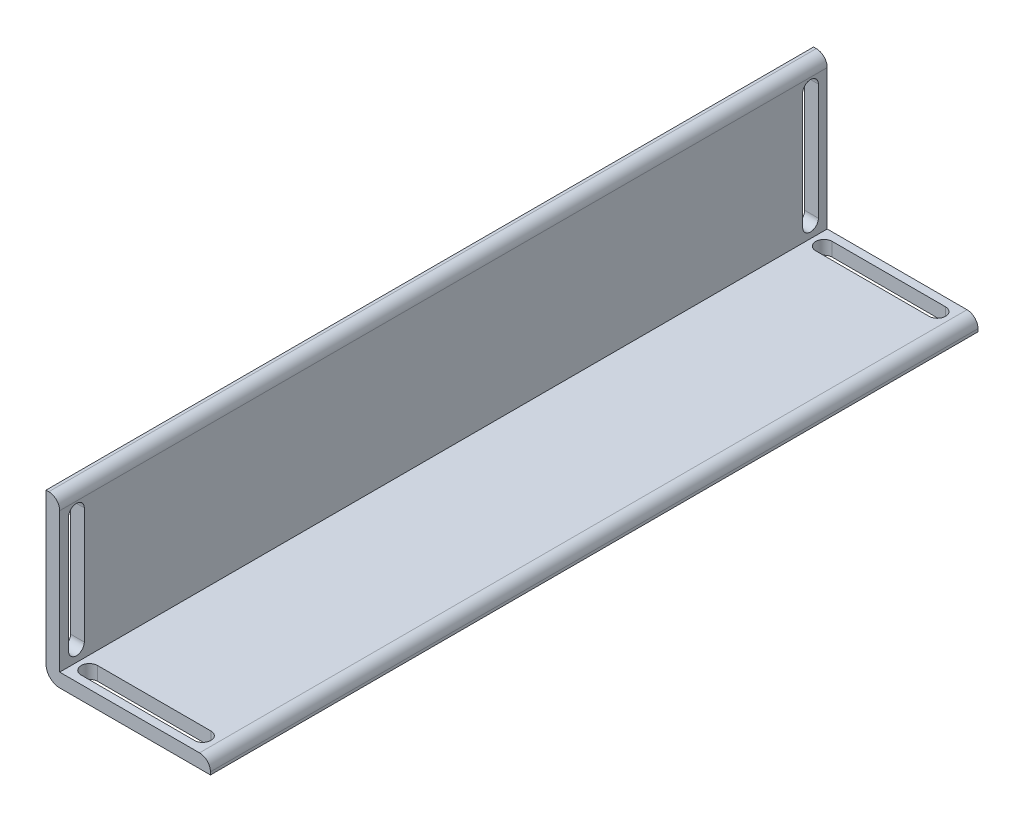
ISO-10303-21;
HEADER;
FILE_DESCRIPTION(('STEP AP214'),'2;1');
FILE_NAME('part.step','',(''),(''),'','','');
FILE_SCHEMA(('AUTOMOTIVE_DESIGN { 1 0 10303 214 1 1 1 1 }'));
ENDSEC;
DATA;
#1=APPLICATION_CONTEXT('core data for automotive mechanical design processes');
#2=APPLICATION_PROTOCOL_DEFINITION('international standard','automotive_design',2000,#1);
#3=PRODUCT_CONTEXT('',#1,'mechanical');
#4=PRODUCT('Part','Part','',(#3));
#5=PRODUCT_RELATED_PRODUCT_CATEGORY('part','',(#4));
#6=PRODUCT_DEFINITION_FORMATION('','',#4);
#7=PRODUCT_DEFINITION_CONTEXT('part definition',#1,'design');
#8=PRODUCT_DEFINITION('design','',#6,#7);
#9=PRODUCT_DEFINITION_SHAPE('','',#8);
#10=(LENGTH_UNIT() NAMED_UNIT(*) SI_UNIT(.MILLI.,.METRE.));
#11=(NAMED_UNIT(*) PLANE_ANGLE_UNIT() SI_UNIT($,.RADIAN.));
#12=(NAMED_UNIT(*) SI_UNIT($,.STERADIAN.) SOLID_ANGLE_UNIT());
#13=UNCERTAINTY_MEASURE_WITH_UNIT(LENGTH_MEASURE(1.E-05),#10,'distance_accuracy_value','');
#14=(GEOMETRIC_REPRESENTATION_CONTEXT(3) GLOBAL_UNCERTAINTY_ASSIGNED_CONTEXT((#13)) GLOBAL_UNIT_ASSIGNED_CONTEXT((#10,
#11,#12)) REPRESENTATION_CONTEXT('',''));
#15=CARTESIAN_POINT('',(0.,0.,0.));
#16=DIRECTION('',(0.,0.,1.));
#17=DIRECTION('',(1.,0.,0.));
#18=AXIS2_PLACEMENT_3D('',#15,#16,#17);
#19=CARTESIAN_POINT('',(38.1,0.,177.8));
#20=DIRECTION('',(0.,1.,0.));
#21=DIRECTION('',(-1.,0.,0.));
#22=AXIS2_PLACEMENT_3D('',#19,#20,#21);
#23=PLANE('',#22);
#24=CARTESIAN_POINT('',(6.23203601937777,0.,173.99));
#25=DIRECTION('',(0.,-1.,0.));
#26=DIRECTION('',(1.,0.,0.));
#27=AXIS2_PLACEMENT_3D('',#24,#25,#26);
#28=CIRCLE('',#27,1.90500000000002);
#29=CARTESIAN_POINT('',(6.23203601937777,0.,175.895));
#30=VERTEX_POINT('',#29);
#31=CARTESIAN_POINT('',(6.23203601937777,0.,172.085));
#32=VERTEX_POINT('',#31);
#33=EDGE_CURVE('E225',#30,#32,#28,.T.);
#34=ORIENTED_EDGE('',*,*,#33,.F.);
#35=DIRECTION('',(-1.,0.,0.));
#36=VECTOR('',#35,1.);
#37=CARTESIAN_POINT('',(1.85924714280096E-13,0.,175.895));
#38=LINE('',#37,#36);
#39=CARTESIAN_POINT('',(32.4903362771703,0.,175.895));
#40=VERTEX_POINT('',#39);
#41=EDGE_CURVE('E55',#40,#30,#38,.T.);
#42=ORIENTED_EDGE('',*,*,#41,.F.);
#43=CARTESIAN_POINT('',(32.4903362771703,0.,173.99));
#44=DIRECTION('',(0.,-1.,0.));
#45=DIRECTION('',(1.,0.,0.));
#46=AXIS2_PLACEMENT_3D('',#43,#44,#45);
#47=CIRCLE('',#46,1.90499999999999);
#48=CARTESIAN_POINT('',(32.4903362771703,0.,172.085));
#49=VERTEX_POINT('',#48);
#50=EDGE_CURVE('E232',#49,#40,#47,.T.);
#51=ORIENTED_EDGE('',*,*,#50,.F.);
#52=DIRECTION('',(-1.,0.,0.));
#53=VECTOR('',#52,1.);
#54=CARTESIAN_POINT('',(-1.81897464151285E-13,0.,172.085));
#55=LINE('',#54,#53);
#56=EDGE_CURVE('E214',#49,#32,#55,.T.);
#57=ORIENTED_EDGE('',*,*,#56,.T.);
#58=EDGE_LOOP('',(#34,#42,#51,#57));
#59=FACE_BOUND('',#58,.T.);
#60=DIRECTION('',(1.,0.,0.));
#61=VECTOR('',#60,1.);
#62=CARTESIAN_POINT('',(38.1,0.,177.8));
#63=LINE('',#62,#61);
#64=CARTESIAN_POINT('',(3.17500000000001,0.,177.8));
#65=VERTEX_POINT('',#64);
#66=CARTESIAN_POINT('',(38.1,0.,177.8));
#67=VERTEX_POINT('',#66);
#68=EDGE_CURVE('E330',#65,#67,#63,.T.);
#69=ORIENTED_EDGE('',*,*,#68,.F.);
#70=DIRECTION('',(0.,0.,-1.));
#71=VECTOR('',#70,1.);
#72=CARTESIAN_POINT('',(3.175,0.,177.8));
#73=LINE('',#72,#71);
#74=CARTESIAN_POINT('',(3.17500000000001,0.,0.));
#75=VERTEX_POINT('',#74);
#76=EDGE_CURVE('E407',#65,#75,#73,.T.);
#77=ORIENTED_EDGE('',*,*,#76,.T.);
#78=DIRECTION('',(1.,0.,0.));
#79=VECTOR('',#78,1.);
#80=CARTESIAN_POINT('',(38.1,0.,0.));
#81=LINE('',#80,#79);
#82=CARTESIAN_POINT('',(38.1,0.,0.));
#83=VERTEX_POINT('',#82);
#84=EDGE_CURVE('E293',#75,#83,#81,.T.);
#85=ORIENTED_EDGE('',*,*,#84,.T.);
#86=DIRECTION('',(0.,0.,-1.));
#87=VECTOR('',#86,1.);
#88=CARTESIAN_POINT('',(38.1,0.,177.8));
#89=LINE('',#88,#87);
#90=EDGE_CURVE('E403',#67,#83,#89,.T.);
#91=ORIENTED_EDGE('',*,*,#90,.F.);
#92=EDGE_LOOP('',(#69,#77,#85,#91));
#93=FACE_BOUND('',#92,.T.);
#94=CARTESIAN_POINT('',(6.23203601937779,0.,3.81000000000001));
#95=DIRECTION('',(0.,-1.,0.));
#96=DIRECTION('',(1.,0.,0.));
#97=AXIS2_PLACEMENT_3D('',#94,#95,#96);
#98=CIRCLE('',#97,1.90500000000002);
#99=CARTESIAN_POINT('',(6.23203601937778,0.,1.90499999999998));
#100=VERTEX_POINT('',#99);
#101=CARTESIAN_POINT('',(6.23203601937779,0.,5.71500000000003));
#102=VERTEX_POINT('',#101);
#103=EDGE_CURVE('E63',#100,#102,#98,.F.);
#104=ORIENTED_EDGE('',*,*,#103,.T.);
#105=DIRECTION('',(-1.,0.,0.));
#106=VECTOR('',#105,1.);
#107=CARTESIAN_POINT('',(0.,0.,5.71500000000003));
#108=LINE('',#107,#106);
#109=CARTESIAN_POINT('',(32.4903362771703,0.,5.715));
#110=VERTEX_POINT('',#109);
#111=EDGE_CURVE('E257',#110,#102,#108,.T.);
#112=ORIENTED_EDGE('',*,*,#111,.F.);
#113=CARTESIAN_POINT('',(32.4903362771703,0.,3.81000000000001));
#114=DIRECTION('',(0.,-1.,0.));
#115=DIRECTION('',(1.,0.,0.));
#116=AXIS2_PLACEMENT_3D('',#113,#114,#115);
#117=CIRCLE('',#116,1.90499999999999);
#118=CARTESIAN_POINT('',(32.4903362771703,0.,1.90500000000002));
#119=VERTEX_POINT('',#118);
#120=EDGE_CURVE('E253',#110,#119,#117,.F.);
#121=ORIENTED_EDGE('',*,*,#120,.T.);
#122=DIRECTION('',(-1.,0.,0.));
#123=VECTOR('',#122,1.);
#124=CARTESIAN_POINT('',(0.,0.,1.90499999999998));
#125=LINE('',#124,#123);
#126=EDGE_CURVE('E249',#119,#100,#125,.T.);
#127=ORIENTED_EDGE('',*,*,#126,.T.);
#128=EDGE_LOOP('',(#104,#112,#121,#127));
#129=FACE_BOUND('',#128,.T.);
#130=ADVANCED_FACE('F39',(#59,#93,#129),#23,.F.);
#131=CARTESIAN_POINT('',(3.175,3.175,177.8));
#132=DIRECTION('',(0.,-1.,0.));
#133=DIRECTION('',(0.,0.,-1.));
#134=AXIS2_PLACEMENT_3D('',#131,#132,#133);
#135=PLANE('',#134);
#136=CARTESIAN_POINT('',(32.4903362771703,3.17500000000001,173.99));
#137=DIRECTION('',(0.,-1.,0.));
#138=DIRECTION('',(0.,0.,-1.));
#139=AXIS2_PLACEMENT_3D('',#136,#137,#138);
#140=CIRCLE('',#139,1.90499999999999);
#141=CARTESIAN_POINT('',(32.4903362771703,3.17500000000001,172.085));
#142=VERTEX_POINT('',#141);
#143=CARTESIAN_POINT('',(32.4903362771703,3.17500000000001,175.895));
#144=VERTEX_POINT('',#143);
#145=EDGE_CURVE('E48',#142,#144,#140,.T.);
#146=ORIENTED_EDGE('',*,*,#145,.T.);
#147=DIRECTION('',(-1.,0.,0.));
#148=VECTOR('',#147,1.);
#149=CARTESIAN_POINT('',(3.175,3.175,175.895));
#150=LINE('',#149,#148);
#151=CARTESIAN_POINT('',(6.23203601937777,3.17500000000001,175.895));
#152=VERTEX_POINT('',#151);
#153=EDGE_CURVE('E11',#144,#152,#150,.T.);
#154=ORIENTED_EDGE('',*,*,#153,.T.);
#155=CARTESIAN_POINT('',(6.23203601937777,3.17500000000001,173.99));
#156=DIRECTION('',(0.,-1.,0.));
#157=DIRECTION('',(0.,0.,-1.));
#158=AXIS2_PLACEMENT_3D('',#155,#156,#157);
#159=CIRCLE('',#158,1.90500000000002);
#160=CARTESIAN_POINT('',(6.23203601937777,3.17500000000001,172.085));
#161=VERTEX_POINT('',#160);
#162=EDGE_CURVE('E463',#152,#161,#159,.T.);
#163=ORIENTED_EDGE('',*,*,#162,.T.);
#164=DIRECTION('',(-1.,0.,0.));
#165=VECTOR('',#164,1.);
#166=CARTESIAN_POINT('',(3.17500000000001,3.175,172.085));
#167=LINE('',#166,#165);
#168=EDGE_CURVE('E217',#142,#161,#167,.T.);
#169=ORIENTED_EDGE('',*,*,#168,.F.);
#170=EDGE_LOOP('',(#146,#154,#163,#169));
#171=FACE_BOUND('',#170,.T.);
#172=DIRECTION('',(-1.,0.,0.));
#173=VECTOR('',#172,1.);
#174=CARTESIAN_POINT('',(3.175,3.175,0.));
#175=LINE('',#174,#173);
#176=CARTESIAN_POINT('',(35.56,3.175,0.));
#177=VERTEX_POINT('',#176);
#178=CARTESIAN_POINT('',(3.175,3.175,0.));
#179=VERTEX_POINT('',#178);
#180=EDGE_CURVE('E365',#177,#179,#175,.T.);
#181=ORIENTED_EDGE('',*,*,#180,.T.);
#182=DIRECTION('',(0.,0.,-1.));
#183=VECTOR('',#182,1.);
#184=CARTESIAN_POINT('',(3.175,3.175,177.8));
#185=LINE('',#184,#183);
#186=CARTESIAN_POINT('',(3.175,3.175,177.8));
#187=VERTEX_POINT('',#186);
#188=EDGE_CURVE('E391',#187,#179,#185,.T.);
#189=ORIENTED_EDGE('',*,*,#188,.F.);
#190=DIRECTION('',(-1.,0.,0.));
#191=VECTOR('',#190,1.);
#192=CARTESIAN_POINT('',(3.175,3.175,177.8));
#193=LINE('',#192,#191);
#194=CARTESIAN_POINT('',(35.56,3.175,177.8));
#195=VERTEX_POINT('',#194);
#196=EDGE_CURVE('E340',#195,#187,#193,.T.);
#197=ORIENTED_EDGE('',*,*,#196,.F.);
#198=DIRECTION('',(0.,0.,-1.));
#199=VECTOR('',#198,1.);
#200=CARTESIAN_POINT('',(35.56,3.175,177.8));
#201=LINE('',#200,#199);
#202=EDGE_CURVE('E395',#195,#177,#201,.T.);
#203=ORIENTED_EDGE('',*,*,#202,.T.);
#204=EDGE_LOOP('',(#181,#189,#197,#203));
#205=FACE_BOUND('',#204,.T.);
#206=CARTESIAN_POINT('',(6.23203601937779,3.17500000000001,3.81000000000001));
#207=DIRECTION('',(0.,-1.,0.));
#208=DIRECTION('',(0.,0.,-1.));
#209=AXIS2_PLACEMENT_3D('',#206,#207,#208);
#210=CIRCLE('',#209,1.90500000000002);
#211=CARTESIAN_POINT('',(6.23203601937779,3.17500000000001,1.90499999999999));
#212=VERTEX_POINT('',#211);
#213=CARTESIAN_POINT('',(6.23203601937779,3.17500000000001,5.71500000000003));
#214=VERTEX_POINT('',#213);
#215=EDGE_CURVE('E460',#212,#214,#210,.F.);
#216=ORIENTED_EDGE('',*,*,#215,.F.);
#217=DIRECTION('',(-1.,0.,0.));
#218=VECTOR('',#217,1.);
#219=CARTESIAN_POINT('',(3.17500000000019,3.175,1.90499999999999));
#220=LINE('',#219,#218);
#221=CARTESIAN_POINT('',(32.4903362771703,3.175,1.90500000000002));
#222=VERTEX_POINT('',#221);
#223=EDGE_CURVE('E449',#222,#212,#220,.T.);
#224=ORIENTED_EDGE('',*,*,#223,.F.);
#225=CARTESIAN_POINT('',(32.4903362771703,3.17500000000001,3.81000000000001));
#226=DIRECTION('',(0.,-1.,0.));
#227=DIRECTION('',(0.,0.,-1.));
#228=AXIS2_PLACEMENT_3D('',#225,#226,#227);
#229=CIRCLE('',#228,1.90499999999999);
#230=CARTESIAN_POINT('',(32.4903362771703,3.17500000000001,5.715));
#231=VERTEX_POINT('',#230);
#232=EDGE_CURVE('E452',#231,#222,#229,.F.);
#233=ORIENTED_EDGE('',*,*,#232,.F.);
#234=DIRECTION('',(-1.,0.,0.));
#235=VECTOR('',#234,1.);
#236=CARTESIAN_POINT('',(3.17499999999982,3.175,5.71500000000003));
#237=LINE('',#236,#235);
#238=EDGE_CURVE('E456',#231,#214,#237,.T.);
#239=ORIENTED_EDGE('',*,*,#238,.T.);
#240=EDGE_LOOP('',(#216,#224,#233,#239));
#241=FACE_BOUND('',#240,.T.);
#242=ADVANCED_FACE('F470',(#171,#205,#241),#135,.F.);
#243=CARTESIAN_POINT('',(3.175,35.56,177.8));
#244=DIRECTION('',(-1.,0.,0.));
#245=DIRECTION('',(0.,-1.,0.));
#246=AXIS2_PLACEMENT_3D('',#243,#244,#245);
#247=PLANE('',#246);
#248=DIRECTION('',(0.,-1.,0.));
#249=VECTOR('',#248,1.);
#250=CARTESIAN_POINT('',(3.175,33.2660008316405,175.757561706071));
#251=LINE('',#250,#249);
#252=CARTESIAN_POINT('',(3.175,33.2660008316405,175.757561706071));
#253=VERTEX_POINT('',#252);
#254=CARTESIAN_POINT('',(3.175,6.35722326987794,175.757561706071));
#255=VERTEX_POINT('',#254);
#256=EDGE_CURVE('E276',#253,#255,#251,.T.);
#257=ORIENTED_EDGE('',*,*,#256,.F.);
#258=CARTESIAN_POINT('',(3.175,33.2660008316405,173.929295250492));
#259=DIRECTION('',(1.,0.,0.));
#260=DIRECTION('',(0.,1.,0.));
#261=AXIS2_PLACEMENT_3D('',#258,#259,#260);
#262=CIRCLE('',#261,1.8282664555785);
#263=CARTESIAN_POINT('',(3.175,33.2660008316405,172.101028794914));
#264=VERTEX_POINT('',#263);
#265=EDGE_CURVE('E273',#264,#253,#262,.T.);
#266=ORIENTED_EDGE('',*,*,#265,.F.);
#267=DIRECTION('',(0.,-1.,0.));
#268=VECTOR('',#267,1.);
#269=CARTESIAN_POINT('',(3.175,33.2660008316405,172.101028794914));
#270=LINE('',#269,#268);
#271=CARTESIAN_POINT('',(3.175,6.35722326987794,172.101028794914));
#272=VERTEX_POINT('',#271);
#273=EDGE_CURVE('E285',#264,#272,#270,.T.);
#274=ORIENTED_EDGE('',*,*,#273,.T.);
#275=CARTESIAN_POINT('',(3.175,6.35722326987794,173.929295250492));
#276=DIRECTION('',(1.,0.,0.));
#277=DIRECTION('',(0.,1.,0.));
#278=AXIS2_PLACEMENT_3D('',#275,#276,#277);
#279=CIRCLE('',#278,1.82826645557849);
#280=EDGE_CURVE('E281',#255,#272,#279,.T.);
#281=ORIENTED_EDGE('',*,*,#280,.F.);
#282=EDGE_LOOP('',(#257,#266,#274,#281));
#283=FACE_BOUND('',#282,.T.);
#284=DIRECTION('',(0.,1.,0.));
#285=VECTOR('',#284,1.);
#286=CARTESIAN_POINT('',(3.175,35.56,0.));
#287=LINE('',#286,#285);
#288=CARTESIAN_POINT('',(3.175,35.56,0.));
#289=VERTEX_POINT('',#288);
#290=EDGE_CURVE('E368',#179,#289,#287,.T.);
#291=ORIENTED_EDGE('',*,*,#290,.T.);
#292=DIRECTION('',(0.,0.,-1.));
#293=VECTOR('',#292,1.);
#294=CARTESIAN_POINT('',(3.175,35.56,177.8));
#295=LINE('',#294,#293);
#296=CARTESIAN_POINT('',(3.175,35.56,177.8));
#297=VERTEX_POINT('',#296);
#298=EDGE_CURVE('E387',#297,#289,#295,.T.);
#299=ORIENTED_EDGE('',*,*,#298,.F.);
#300=DIRECTION('',(0.,1.,0.));
#301=VECTOR('',#300,1.);
#302=CARTESIAN_POINT('',(3.175,35.56,177.8));
#303=LINE('',#302,#301);
#304=EDGE_CURVE('E343',#187,#297,#303,.T.);
#305=ORIENTED_EDGE('',*,*,#304,.F.);
#306=ORIENTED_EDGE('',*,*,#188,.T.);
#307=EDGE_LOOP('',(#291,#299,#305,#306));
#308=FACE_BOUND('',#307,.T.);
#309=CARTESIAN_POINT('',(3.175,33.2660008316405,3.87070474950793));
#310=DIRECTION('',(-1.,0.,0.));
#311=DIRECTION('',(0.,-1.,0.));
#312=AXIS2_PLACEMENT_3D('',#309,#310,#311);
#313=CIRCLE('',#312,1.82826645557849);
#314=CARTESIAN_POINT('',(3.175,33.2660008316405,5.69897120508642));
#315=VERTEX_POINT('',#314);
#316=CARTESIAN_POINT('',(3.175,33.2660008316405,2.04243829392943));
#317=VERTEX_POINT('',#316);
#318=EDGE_CURVE('E277',#315,#317,#313,.T.);
#319=ORIENTED_EDGE('',*,*,#318,.T.);
#320=DIRECTION('',(0.,-1.,0.));
#321=VECTOR('',#320,1.);
#322=CARTESIAN_POINT('',(3.175,33.2660008316405,2.04243829392943));
#323=LINE('',#322,#321);
#324=CARTESIAN_POINT('',(3.175,6.35722326987794,2.04243829392943));
#325=VERTEX_POINT('',#324);
#326=EDGE_CURVE('E323',#317,#325,#323,.T.);
#327=ORIENTED_EDGE('',*,*,#326,.T.);
#328=CARTESIAN_POINT('',(3.175,6.35722326987794,3.87070474950793));
#329=DIRECTION('',(-1.,0.,0.));
#330=DIRECTION('',(0.,-1.,0.));
#331=AXIS2_PLACEMENT_3D('',#328,#329,#330);
#332=CIRCLE('',#331,1.82826645557849);
#333=CARTESIAN_POINT('',(3.175,6.35722326987794,5.69897120508643));
#334=VERTEX_POINT('',#333);
#335=EDGE_CURVE('E319',#325,#334,#332,.T.);
#336=ORIENTED_EDGE('',*,*,#335,.T.);
#337=DIRECTION('',(0.,-1.,0.));
#338=VECTOR('',#337,1.);
#339=CARTESIAN_POINT('',(3.175,33.2660008316405,5.69897120508642));
#340=LINE('',#339,#338);
#341=EDGE_CURVE('E315',#315,#334,#340,.T.);
#342=ORIENTED_EDGE('',*,*,#341,.F.);
#343=EDGE_LOOP('',(#319,#327,#336,#342));
#344=FACE_BOUND('',#343,.T.);
#345=ADVANCED_FACE('F493',(#283,#308,#344),#247,.F.);
#346=CARTESIAN_POINT('',(0.,0.,177.8));
#347=DIRECTION('',(1.,0.,0.));
#348=DIRECTION('',(0.,0.,-1.));
#349=AXIS2_PLACEMENT_3D('',#346,#347,#348);
#350=PLANE('',#349);
#351=DIRECTION('',(0.,-1.,0.));
#352=VECTOR('',#351,1.);
#353=CARTESIAN_POINT('',(0.,0.,172.101028794914));
#354=LINE('',#353,#352);
#355=CARTESIAN_POINT('',(0.,33.2660008316405,172.101028794914));
#356=VERTEX_POINT('',#355);
#357=CARTESIAN_POINT('',(0.,6.35722326987794,172.101028794914));
#358=VERTEX_POINT('',#357);
#359=EDGE_CURVE('E442',#356,#358,#354,.T.);
#360=ORIENTED_EDGE('',*,*,#359,.F.);
#361=CARTESIAN_POINT('',(0.,33.2660008316405,173.929295250492));
#362=DIRECTION('',(1.,0.,0.));
#363=DIRECTION('',(0.,0.,-1.));
#364=AXIS2_PLACEMENT_3D('',#361,#362,#363);
#365=CIRCLE('',#364,1.8282664555785);
#366=CARTESIAN_POINT('',(0.,33.2660008316405,175.757561706071));
#367=VERTEX_POINT('',#366);
#368=EDGE_CURVE('E445',#356,#367,#365,.T.);
#369=ORIENTED_EDGE('',*,*,#368,.T.);
#370=DIRECTION('',(0.,-1.,0.));
#371=VECTOR('',#370,1.);
#372=CARTESIAN_POINT('',(0.,0.,175.757561706071));
#373=LINE('',#372,#371);
#374=CARTESIAN_POINT('',(0.,6.35722326987792,175.757561706071));
#375=VERTEX_POINT('',#374);
#376=EDGE_CURVE('E434',#367,#375,#373,.T.);
#377=ORIENTED_EDGE('',*,*,#376,.T.);
#378=CARTESIAN_POINT('',(0.,6.35722326987794,173.929295250492));
#379=DIRECTION('',(1.,0.,0.));
#380=DIRECTION('',(0.,0.,-1.));
#381=AXIS2_PLACEMENT_3D('',#378,#379,#380);
#382=CIRCLE('',#381,1.82826645557849);
#383=EDGE_CURVE('E438',#375,#358,#382,.T.);
#384=ORIENTED_EDGE('',*,*,#383,.T.);
#385=EDGE_LOOP('',(#360,#369,#377,#384));
#386=FACE_BOUND('',#385,.T.);
#387=DIRECTION('',(0.,-1.,0.));
#388=VECTOR('',#387,1.);
#389=CARTESIAN_POINT('',(0.,0.,0.));
#390=LINE('',#389,#388);
#391=CARTESIAN_POINT('',(0.,38.1,0.));
#392=VERTEX_POINT('',#391);
#393=CARTESIAN_POINT('',(0.,3.175,0.));
#394=VERTEX_POINT('',#393);
#395=EDGE_CURVE('E334',#392,#394,#390,.T.);
#396=ORIENTED_EDGE('',*,*,#395,.T.);
#397=DIRECTION('',(0.,0.,-1.));
#398=VECTOR('',#397,1.);
#399=CARTESIAN_POINT('',(0.,3.175,177.8));
#400=LINE('',#399,#398);
#401=CARTESIAN_POINT('',(0.,3.175,177.8));
#402=VERTEX_POINT('',#401);
#403=EDGE_CURVE('E414',#394,#402,#400,.F.);
#404=ORIENTED_EDGE('',*,*,#403,.T.);
#405=DIRECTION('',(0.,-1.,0.));
#406=VECTOR('',#405,1.);
#407=CARTESIAN_POINT('',(0.,0.,177.8));
#408=LINE('',#407,#406);
#409=CARTESIAN_POINT('',(0.,38.1,177.8));
#410=VERTEX_POINT('',#409);
#411=EDGE_CURVE('E352',#410,#402,#408,.T.);
#412=ORIENTED_EDGE('',*,*,#411,.F.);
#413=DIRECTION('',(0.,0.,-1.));
#414=VECTOR('',#413,1.);
#415=CARTESIAN_POINT('',(0.,38.1,177.8));
#416=LINE('',#415,#414);
#417=EDGE_CURVE('E356',#410,#392,#416,.T.);
#418=ORIENTED_EDGE('',*,*,#417,.T.);
#419=EDGE_LOOP('',(#396,#404,#412,#418));
#420=FACE_BOUND('',#419,.T.);
#421=CARTESIAN_POINT('',(0.,33.2660008316405,3.87070474950793));
#422=DIRECTION('',(1.,0.,0.));
#423=DIRECTION('',(0.,0.,-1.));
#424=AXIS2_PLACEMENT_3D('',#421,#422,#423);
#425=CIRCLE('',#424,1.82826645557849);
#426=CARTESIAN_POINT('',(0.,33.2660008316405,5.69897120508642));
#427=VERTEX_POINT('',#426);
#428=CARTESIAN_POINT('',(0.,33.2660008316405,2.04243829392943));
#429=VERTEX_POINT('',#428);
#430=EDGE_CURVE('E431',#427,#429,#425,.F.);
#431=ORIENTED_EDGE('',*,*,#430,.F.);
#432=DIRECTION('',(0.,-1.,0.));
#433=VECTOR('',#432,1.);
#434=CARTESIAN_POINT('',(0.,0.,5.69897120508642));
#435=LINE('',#434,#433);
#436=CARTESIAN_POINT('',(0.,6.35722326987792,5.69897120508642));
#437=VERTEX_POINT('',#436);
#438=EDGE_CURVE('E420',#427,#437,#435,.T.);
#439=ORIENTED_EDGE('',*,*,#438,.T.);
#440=CARTESIAN_POINT('',(0.,6.35722326987794,3.87070474950793));
#441=DIRECTION('',(1.,0.,0.));
#442=DIRECTION('',(0.,0.,-1.));
#443=AXIS2_PLACEMENT_3D('',#440,#441,#442);
#444=CIRCLE('',#443,1.82826645557849);
#445=CARTESIAN_POINT('',(0.,6.35722326987794,2.04243829392943));
#446=VERTEX_POINT('',#445);
#447=EDGE_CURVE('E424',#446,#437,#444,.F.);
#448=ORIENTED_EDGE('',*,*,#447,.F.);
#449=DIRECTION('',(0.,-1.,0.));
#450=VECTOR('',#449,1.);
#451=CARTESIAN_POINT('',(0.,0.,2.04243829392944));
#452=LINE('',#451,#450);
#453=EDGE_CURVE('E428',#429,#446,#452,.T.);
#454=ORIENTED_EDGE('',*,*,#453,.F.);
#455=EDGE_LOOP('',(#431,#439,#448,#454));
#456=FACE_BOUND('',#455,.T.);
#457=ADVANCED_FACE('F500',(#386,#420,#456),#350,.F.);
#458=CARTESIAN_POINT('',(38.1,0.634999999999997,177.8));
#459=DIRECTION('',(-1.,0.,0.));
#460=DIRECTION('',(0.,0.,1.));
#461=AXIS2_PLACEMENT_3D('',#458,#459,#460);
#462=PLANE('',#461);
#463=DIRECTION('',(0.,1.,0.));
#464=VECTOR('',#463,1.);
#465=CARTESIAN_POINT('',(38.1,0.634999999999997,0.));
#466=LINE('',#465,#464);
#467=CARTESIAN_POINT('',(38.1,0.634999999999997,0.));
#468=VERTEX_POINT('',#467);
#469=EDGE_CURVE('E359',#83,#468,#466,.T.);
#470=ORIENTED_EDGE('',*,*,#469,.T.);
#471=DIRECTION('',(0.,0.,-1.));
#472=VECTOR('',#471,1.);
#473=CARTESIAN_POINT('',(38.1,0.634999999999997,177.8));
#474=LINE('',#473,#472);
#475=CARTESIAN_POINT('',(38.1,0.634999999999997,177.8));
#476=VERTEX_POINT('',#475);
#477=EDGE_CURVE('E399',#476,#468,#474,.T.);
#478=ORIENTED_EDGE('',*,*,#477,.F.);
#479=DIRECTION('',(0.,1.,0.));
#480=VECTOR('',#479,1.);
#481=CARTESIAN_POINT('',(38.1,0.634999999999997,177.8));
#482=LINE('',#481,#480);
#483=EDGE_CURVE('E333',#67,#476,#482,.T.);
#484=ORIENTED_EDGE('',*,*,#483,.F.);
#485=ORIENTED_EDGE('',*,*,#90,.T.);
#486=EDGE_LOOP('',(#470,#478,#484,#485));
#487=FACE_BOUND('',#486,.T.);
#488=ADVANCED_FACE('F496',(#487),#462,.F.);
#489=CARTESIAN_POINT('',(35.56,0.634999999999997,177.8));
#490=DIRECTION('',(0.,0.,-1.));
#491=DIRECTION('',(-1.,0.,0.));
#492=AXIS2_PLACEMENT_3D('',#489,#490,#491);
#493=CYLINDRICAL_SURFACE('',#492,2.54);
#494=CARTESIAN_POINT('',(35.56,0.634999999999997,0.));
#495=DIRECTION('',(0.,0.,1.));
#496=DIRECTION('',(1.,0.,0.));
#497=AXIS2_PLACEMENT_3D('',#494,#495,#496);
#498=CIRCLE('',#497,2.54);
#499=EDGE_CURVE('E362',#468,#177,#498,.T.);
#500=ORIENTED_EDGE('',*,*,#499,.T.);
#501=ORIENTED_EDGE('',*,*,#202,.F.);
#502=CARTESIAN_POINT('',(35.56,0.634999999999997,177.8));
#503=DIRECTION('',(0.,0.,1.));
#504=DIRECTION('',(1.,0.,0.));
#505=AXIS2_PLACEMENT_3D('',#502,#503,#504);
#506=CIRCLE('',#505,2.54);
#507=EDGE_CURVE('E337',#476,#195,#506,.T.);
#508=ORIENTED_EDGE('',*,*,#507,.F.);
#509=ORIENTED_EDGE('',*,*,#477,.T.);
#510=EDGE_LOOP('',(#500,#501,#508,#509));
#511=FACE_BOUND('',#510,.T.);
#512=ADVANCED_FACE('F499',(#511),#493,.T.);
#513=CARTESIAN_POINT('',(0.634999999999998,35.56,177.8));
#514=DIRECTION('',(0.,0.,-1.));
#515=DIRECTION('',(-1.,0.,0.));
#516=AXIS2_PLACEMENT_3D('',#513,#514,#515);
#517=CYLINDRICAL_SURFACE('',#516,2.54);
#518=CARTESIAN_POINT('',(0.634999999999998,35.56,0.));
#519=DIRECTION('',(0.,0.,1.));
#520=DIRECTION('',(1.,0.,0.));
#521=AXIS2_PLACEMENT_3D('',#518,#519,#520);
#522=CIRCLE('',#521,2.54);
#523=CARTESIAN_POINT('',(0.634999999999998,38.1,0.));
#524=VERTEX_POINT('',#523);
#525=EDGE_CURVE('E371',#289,#524,#522,.T.);
#526=ORIENTED_EDGE('',*,*,#525,.T.);
#527=DIRECTION('',(0.,0.,-1.));
#528=VECTOR('',#527,1.);
#529=CARTESIAN_POINT('',(0.634999999999998,38.1,177.8));
#530=LINE('',#529,#528);
#531=CARTESIAN_POINT('',(0.634999999999998,38.1,177.8));
#532=VERTEX_POINT('',#531);
#533=EDGE_CURVE('E383',#532,#524,#530,.T.);
#534=ORIENTED_EDGE('',*,*,#533,.F.);
#535=CARTESIAN_POINT('',(0.634999999999998,35.56,177.8));
#536=DIRECTION('',(0.,0.,1.));
#537=DIRECTION('',(1.,0.,0.));
#538=AXIS2_PLACEMENT_3D('',#535,#536,#537);
#539=CIRCLE('',#538,2.54);
#540=EDGE_CURVE('E346',#297,#532,#539,.T.);
#541=ORIENTED_EDGE('',*,*,#540,.F.);
#542=ORIENTED_EDGE('',*,*,#298,.T.);
#543=EDGE_LOOP('',(#526,#534,#541,#542));
#544=FACE_BOUND('',#543,.T.);
#545=ADVANCED_FACE('F503',(#544),#517,.T.);
#546=CARTESIAN_POINT('',(0.,38.1,177.8));
#547=DIRECTION('',(0.,-1.,0.));
#548=DIRECTION('',(0.,0.,-1.));
#549=AXIS2_PLACEMENT_3D('',#546,#547,#548);
#550=PLANE('',#549);
#551=DIRECTION('',(-1.,0.,0.));
#552=VECTOR('',#551,1.);
#553=CARTESIAN_POINT('',(0.,38.1,0.));
#554=LINE('',#553,#552);
#555=EDGE_CURVE('E374',#524,#392,#554,.T.);
#556=ORIENTED_EDGE('',*,*,#555,.T.);
#557=ORIENTED_EDGE('',*,*,#417,.F.);
#558=DIRECTION('',(-1.,0.,0.));
#559=VECTOR('',#558,1.);
#560=CARTESIAN_POINT('',(0.,38.1,177.8));
#561=LINE('',#560,#559);
#562=EDGE_CURVE('E349',#532,#410,#561,.T.);
#563=ORIENTED_EDGE('',*,*,#562,.F.);
#564=ORIENTED_EDGE('',*,*,#533,.T.);
#565=EDGE_LOOP('',(#556,#557,#563,#564));
#566=FACE_BOUND('',#565,.T.);
#567=ADVANCED_FACE('F511',(#566),#550,.F.);
#568=CARTESIAN_POINT('',(0.634999999999998,35.56,177.8));
#569=DIRECTION('',(0.,0.,1.));
#570=DIRECTION('',(1.,0.,0.));
#571=AXIS2_PLACEMENT_3D('',#568,#569,#570);
#572=PLANE('',#571);
#573=ORIENTED_EDGE('',*,*,#411,.T.);
#574=CARTESIAN_POINT('',(3.175,3.175,177.8));
#575=DIRECTION('',(0.,0.,1.));
#576=DIRECTION('',(1.,0.,0.));
#577=AXIS2_PLACEMENT_3D('',#574,#575,#576);
#578=CIRCLE('',#577,3.175);
#579=EDGE_CURVE('E417',#402,#65,#578,.T.);
#580=ORIENTED_EDGE('',*,*,#579,.T.);
#581=ORIENTED_EDGE('',*,*,#68,.T.);
#582=ORIENTED_EDGE('',*,*,#483,.T.);
#583=ORIENTED_EDGE('',*,*,#507,.T.);
#584=ORIENTED_EDGE('',*,*,#196,.T.);
#585=ORIENTED_EDGE('',*,*,#304,.T.);
#586=ORIENTED_EDGE('',*,*,#540,.T.);
#587=ORIENTED_EDGE('',*,*,#562,.T.);
#588=EDGE_LOOP('',(#573,#580,#581,#582,#583,#584,#585,#586,#587));
#589=FACE_BOUND('',#588,.T.);
#590=ADVANCED_FACE('F515',(#589),#572,.T.);
#591=CARTESIAN_POINT('',(0.634999999999998,35.56,0.));
#592=DIRECTION('',(0.,0.,1.));
#593=DIRECTION('',(1.,0.,0.));
#594=AXIS2_PLACEMENT_3D('',#591,#592,#593);
#595=PLANE('',#594);
#596=ORIENTED_EDGE('',*,*,#84,.F.);
#597=CARTESIAN_POINT('',(3.175,3.175,0.));
#598=DIRECTION('',(0.,0.,1.));
#599=DIRECTION('',(1.,0.,0.));
#600=AXIS2_PLACEMENT_3D('',#597,#598,#599);
#601=CIRCLE('',#600,3.175);
#602=EDGE_CURVE('E411',#75,#394,#601,.F.);
#603=ORIENTED_EDGE('',*,*,#602,.T.);
#604=ORIENTED_EDGE('',*,*,#395,.F.);
#605=ORIENTED_EDGE('',*,*,#555,.F.);
#606=ORIENTED_EDGE('',*,*,#525,.F.);
#607=ORIENTED_EDGE('',*,*,#290,.F.);
#608=ORIENTED_EDGE('',*,*,#180,.F.);
#609=ORIENTED_EDGE('',*,*,#499,.F.);
#610=ORIENTED_EDGE('',*,*,#469,.F.);
#611=EDGE_LOOP('',(#596,#603,#604,#605,#606,#607,#608,#609,#610));
#612=FACE_BOUND('',#611,.T.);
#613=ADVANCED_FACE('F520',(#612),#595,.F.);
#614=CARTESIAN_POINT('',(3.175,3.175,177.8));
#615=DIRECTION('',(0.,0.,-1.));
#616=DIRECTION('',(-1.,0.,0.));
#617=AXIS2_PLACEMENT_3D('',#614,#615,#616);
#618=CYLINDRICAL_SURFACE('',#617,3.175);
#619=ORIENTED_EDGE('',*,*,#579,.F.);
#620=ORIENTED_EDGE('',*,*,#403,.F.);
#621=ORIENTED_EDGE('',*,*,#602,.F.);
#622=ORIENTED_EDGE('',*,*,#76,.F.);
#623=EDGE_LOOP('',(#619,#620,#621,#622));
#624=FACE_BOUND('',#623,.T.);
#625=ADVANCED_FACE('F41',(#624),#618,.T.);
#626=CARTESIAN_POINT('',(-174.625,33.2660008316405,3.87070474950793));
#627=DIRECTION('',(1.,0.,0.));
#628=DIRECTION('',(0.,1.,0.));
#629=AXIS2_PLACEMENT_3D('',#626,#627,#628);
#630=CYLINDRICAL_SURFACE('',#629,1.82826645557849);
#631=ORIENTED_EDGE('',*,*,#430,.T.);
#632=DIRECTION('',(1.,0.,0.));
#633=VECTOR('',#632,1.);
#634=CARTESIAN_POINT('',(-174.625,33.2660008316405,2.04243829392943));
#635=LINE('',#634,#633);
#636=EDGE_CURVE('E242',#429,#317,#635,.T.);
#637=ORIENTED_EDGE('',*,*,#636,.T.);
#638=ORIENTED_EDGE('',*,*,#318,.F.);
#639=DIRECTION('',(1.,0.,0.));
#640=VECTOR('',#639,1.);
#641=CARTESIAN_POINT('',(-174.625,33.2660008316405,5.69897120508642));
#642=LINE('',#641,#640);
#643=EDGE_CURVE('E311',#427,#315,#642,.T.);
#644=ORIENTED_EDGE('',*,*,#643,.F.);
#645=EDGE_LOOP('',(#631,#637,#638,#644));
#646=FACE_BOUND('',#645,.T.);
#647=ADVANCED_FACE('F539',(#646),#630,.F.);
#648=CARTESIAN_POINT('',(-174.625,33.2660008316405,2.04243829392943));
#649=DIRECTION('',(0.,0.,1.));
#650=DIRECTION('',(0.,-1.,0.));
#651=AXIS2_PLACEMENT_3D('',#648,#649,#650);
#652=PLANE('',#651);
#653=ORIENTED_EDGE('',*,*,#453,.T.);
#654=DIRECTION('',(1.,0.,0.));
#655=VECTOR('',#654,1.);
#656=CARTESIAN_POINT('',(-174.625,6.35722326987792,2.04243829392943));
#657=LINE('',#656,#655);
#658=EDGE_CURVE('E305',#446,#325,#657,.T.);
#659=ORIENTED_EDGE('',*,*,#658,.T.);
#660=ORIENTED_EDGE('',*,*,#326,.F.);
#661=ORIENTED_EDGE('',*,*,#636,.F.);
#662=EDGE_LOOP('',(#653,#659,#660,#661));
#663=FACE_BOUND('',#662,.T.);
#664=ADVANCED_FACE('F535',(#663),#652,.T.);
#665=CARTESIAN_POINT('',(-174.625,6.35722326987792,3.87070474950793));
#666=DIRECTION('',(1.,0.,0.));
#667=DIRECTION('',(0.,1.,0.));
#668=AXIS2_PLACEMENT_3D('',#665,#666,#667);
#669=CYLINDRICAL_SURFACE('',#668,1.82826645557849);
#670=ORIENTED_EDGE('',*,*,#447,.T.);
#671=DIRECTION('',(1.,0.,0.));
#672=VECTOR('',#671,1.);
#673=CARTESIAN_POINT('',(-174.625,6.35722326987792,5.69897120508643));
#674=LINE('',#673,#672);
#675=EDGE_CURVE('E308',#437,#334,#674,.T.);
#676=ORIENTED_EDGE('',*,*,#675,.T.);
#677=ORIENTED_EDGE('',*,*,#335,.F.);
#678=ORIENTED_EDGE('',*,*,#658,.F.);
#679=EDGE_LOOP('',(#670,#676,#677,#678));
#680=FACE_BOUND('',#679,.T.);
#681=ADVANCED_FACE('F531',(#680),#669,.F.);
#682=CARTESIAN_POINT('',(-174.625,33.2660008316405,5.69897120508642));
#683=DIRECTION('',(0.,0.,1.));
#684=DIRECTION('',(1.,0.,0.));
#685=AXIS2_PLACEMENT_3D('',#682,#683,#684);
#686=PLANE('',#685);
#687=ORIENTED_EDGE('',*,*,#643,.T.);
#688=ORIENTED_EDGE('',*,*,#341,.T.);
#689=ORIENTED_EDGE('',*,*,#675,.F.);
#690=ORIENTED_EDGE('',*,*,#438,.F.);
#691=EDGE_LOOP('',(#687,#688,#689,#690));
#692=FACE_BOUND('',#691,.T.);
#693=ADVANCED_FACE('F527',(#692),#686,.F.);
#694=CARTESIAN_POINT('',(-174.625,33.2660008316405,173.929295250492));
#695=DIRECTION('',(1.,0.,0.));
#696=DIRECTION('',(0.,1.,0.));
#697=AXIS2_PLACEMENT_3D('',#694,#695,#696);
#698=CYLINDRICAL_SURFACE('',#697,1.8282664555785);
#699=DIRECTION('',(1.,0.,0.));
#700=VECTOR('',#699,1.);
#701=CARTESIAN_POINT('',(-174.625,33.2660008316405,172.101028794914));
#702=LINE('',#701,#700);
#703=EDGE_CURVE('E290',#356,#264,#702,.T.);
#704=ORIENTED_EDGE('',*,*,#703,.T.);
#705=ORIENTED_EDGE('',*,*,#265,.T.);
#706=DIRECTION('',(1.,0.,0.));
#707=VECTOR('',#706,1.);
#708=CARTESIAN_POINT('',(-174.625,33.2660008316405,175.757561706071));
#709=LINE('',#708,#707);
#710=EDGE_CURVE('E289',#367,#253,#709,.T.);
#711=ORIENTED_EDGE('',*,*,#710,.F.);
#712=ORIENTED_EDGE('',*,*,#368,.F.);
#713=EDGE_LOOP('',(#704,#705,#711,#712));
#714=FACE_BOUND('',#713,.T.);
#715=ADVANCED_FACE('F530',(#714),#698,.F.);
#716=CARTESIAN_POINT('',(-174.625,33.2660008316405,172.101028794914));
#717=DIRECTION('',(0.,0.,1.));
#718=DIRECTION('',(1.,0.,0.));
#719=AXIS2_PLACEMENT_3D('',#716,#717,#718);
#720=PLANE('',#719);
#721=ORIENTED_EDGE('',*,*,#359,.T.);
#722=DIRECTION('',(1.,0.,0.));
#723=VECTOR('',#722,1.);
#724=CARTESIAN_POINT('',(-174.625,6.35722326987792,172.101028794914));
#725=LINE('',#724,#723);
#726=EDGE_CURVE('E294',#358,#272,#725,.T.);
#727=ORIENTED_EDGE('',*,*,#726,.T.);
#728=ORIENTED_EDGE('',*,*,#273,.F.);
#729=ORIENTED_EDGE('',*,*,#703,.F.);
#730=EDGE_LOOP('',(#721,#727,#728,#729));
#731=FACE_BOUND('',#730,.T.);
#732=ADVANCED_FACE('F546',(#731),#720,.T.);
#733=CARTESIAN_POINT('',(-174.625,6.35722326987792,173.929295250492));
#734=DIRECTION('',(1.,0.,0.));
#735=DIRECTION('',(0.,1.,0.));
#736=AXIS2_PLACEMENT_3D('',#733,#734,#735);
#737=CYLINDRICAL_SURFACE('',#736,1.82826645557849);
#738=DIRECTION('',(1.,0.,0.));
#739=VECTOR('',#738,1.);
#740=CARTESIAN_POINT('',(-174.625,6.35722326987792,175.757561706071));
#741=LINE('',#740,#739);
#742=EDGE_CURVE('E297',#375,#255,#741,.T.);
#743=ORIENTED_EDGE('',*,*,#742,.T.);
#744=ORIENTED_EDGE('',*,*,#280,.T.);
#745=ORIENTED_EDGE('',*,*,#726,.F.);
#746=ORIENTED_EDGE('',*,*,#383,.F.);
#747=EDGE_LOOP('',(#743,#744,#745,#746));
#748=FACE_BOUND('',#747,.T.);
#749=ADVANCED_FACE('F552',(#748),#737,.F.);
#750=CARTESIAN_POINT('',(-174.625,33.2660008316405,175.757561706071));
#751=DIRECTION('',(0.,0.,1.));
#752=DIRECTION('',(0.,-1.,0.));
#753=AXIS2_PLACEMENT_3D('',#750,#751,#752);
#754=PLANE('',#753);
#755=ORIENTED_EDGE('',*,*,#710,.T.);
#756=ORIENTED_EDGE('',*,*,#256,.T.);
#757=ORIENTED_EDGE('',*,*,#742,.F.);
#758=ORIENTED_EDGE('',*,*,#376,.F.);
#759=EDGE_LOOP('',(#755,#756,#757,#758));
#760=FACE_BOUND('',#759,.T.);
#761=ADVANCED_FACE('F548',(#760),#754,.F.);
#762=CARTESIAN_POINT('',(6.23203601937778,177.8,3.81000000000001));
#763=DIRECTION('',(0.,-1.,0.));
#764=DIRECTION('',(1.,0.,0.));
#765=AXIS2_PLACEMENT_3D('',#762,#763,#764);
#766=CYLINDRICAL_SURFACE('',#765,1.90500000000002);
#767=ORIENTED_EDGE('',*,*,#215,.T.);
#768=DIRECTION('',(0.,-1.,0.));
#769=VECTOR('',#768,1.);
#770=CARTESIAN_POINT('',(6.23203601937778,177.8,5.71500000000003));
#771=LINE('',#770,#769);
#772=EDGE_CURVE('E262',#214,#102,#771,.T.);
#773=ORIENTED_EDGE('',*,*,#772,.T.);
#774=ORIENTED_EDGE('',*,*,#103,.F.);
#775=DIRECTION('',(0.,-1.,0.));
#776=VECTOR('',#775,1.);
#777=CARTESIAN_POINT('',(6.23203601937778,177.8,1.90499999999999));
#778=LINE('',#777,#776);
#779=EDGE_CURVE('E261',#212,#100,#778,.T.);
#780=ORIENTED_EDGE('',*,*,#779,.F.);
#781=EDGE_LOOP('',(#767,#773,#774,#780));
#782=FACE_BOUND('',#781,.T.);
#783=ADVANCED_FACE('F551',(#782),#766,.F.);
#784=CARTESIAN_POINT('',(0.,177.8,5.71500000000003));
#785=DIRECTION('',(0.,0.,1.));
#786=DIRECTION('',(1.,0.,0.));
#787=AXIS2_PLACEMENT_3D('',#784,#785,#786);
#788=PLANE('',#787);
#789=DIRECTION('',(0.,-1.,0.));
#790=VECTOR('',#789,1.);
#791=CARTESIAN_POINT('',(32.4903362771703,177.8,5.715));
#792=LINE('',#791,#790);
#793=EDGE_CURVE('E265',#231,#110,#792,.T.);
#794=ORIENTED_EDGE('',*,*,#793,.T.);
#795=ORIENTED_EDGE('',*,*,#111,.T.);
#796=ORIENTED_EDGE('',*,*,#772,.F.);
#797=ORIENTED_EDGE('',*,*,#238,.F.);
#798=EDGE_LOOP('',(#794,#795,#796,#797));
#799=FACE_BOUND('',#798,.T.);
#800=ADVANCED_FACE('F561',(#799),#788,.F.);
#801=CARTESIAN_POINT('',(32.4903362771703,177.8,3.81000000000001));
#802=DIRECTION('',(0.,-1.,0.));
#803=DIRECTION('',(1.,0.,0.));
#804=AXIS2_PLACEMENT_3D('',#801,#802,#803);
#805=CYLINDRICAL_SURFACE('',#804,1.90499999999999);
#806=ORIENTED_EDGE('',*,*,#232,.T.);
#807=DIRECTION('',(0.,-1.,0.));
#808=VECTOR('',#807,1.);
#809=CARTESIAN_POINT('',(32.4903362771703,177.8,1.90500000000002));
#810=LINE('',#809,#808);
#811=EDGE_CURVE('E268',#222,#119,#810,.T.);
#812=ORIENTED_EDGE('',*,*,#811,.T.);
#813=ORIENTED_EDGE('',*,*,#120,.F.);
#814=ORIENTED_EDGE('',*,*,#793,.F.);
#815=EDGE_LOOP('',(#806,#812,#813,#814));
#816=FACE_BOUND('',#815,.T.);
#817=ADVANCED_FACE('F484',(#816),#805,.F.);
#818=CARTESIAN_POINT('',(0.,177.8,1.90499999999998));
#819=DIRECTION('',(0.,0.,1.));
#820=DIRECTION('',(1.,0.,0.));
#821=AXIS2_PLACEMENT_3D('',#818,#819,#820);
#822=PLANE('',#821);
#823=ORIENTED_EDGE('',*,*,#223,.T.);
#824=ORIENTED_EDGE('',*,*,#779,.T.);
#825=ORIENTED_EDGE('',*,*,#126,.F.);
#826=ORIENTED_EDGE('',*,*,#811,.F.);
#827=EDGE_LOOP('',(#823,#824,#825,#826));
#828=FACE_BOUND('',#827,.T.);
#829=ADVANCED_FACE('F477',(#828),#822,.T.);
#830=CARTESIAN_POINT('',(1.78666640917149E-13,177.8,175.895));
#831=DIRECTION('',(0.,0.,1.));
#832=DIRECTION('',(1.,0.,0.));
#833=AXIS2_PLACEMENT_3D('',#830,#831,#832);
#834=PLANE('',#833);
#835=DIRECTION('',(0.,-1.,0.));
#836=VECTOR('',#835,1.);
#837=CARTESIAN_POINT('',(32.4903362771703,177.8,175.895));
#838=LINE('',#837,#836);
#839=EDGE_CURVE('E239',#144,#40,#838,.T.);
#840=ORIENTED_EDGE('',*,*,#839,.T.);
#841=ORIENTED_EDGE('',*,*,#41,.T.);
#842=DIRECTION('',(0.,-1.,0.));
#843=VECTOR('',#842,1.);
#844=CARTESIAN_POINT('',(6.23203601937777,177.8,175.895));
#845=LINE('',#844,#843);
#846=EDGE_CURVE('E222',#152,#30,#845,.T.);
#847=ORIENTED_EDGE('',*,*,#846,.F.);
#848=ORIENTED_EDGE('',*,*,#153,.F.);
#849=EDGE_LOOP('',(#840,#841,#847,#848));
#850=FACE_BOUND('',#849,.T.);
#851=ADVANCED_FACE('F475',(#850),#834,.F.);
#852=CARTESIAN_POINT('',(32.4903362771703,177.8,173.99));
#853=DIRECTION('',(0.,-1.,0.));
#854=DIRECTION('',(1.,0.,0.));
#855=AXIS2_PLACEMENT_3D('',#852,#853,#854);
#856=CYLINDRICAL_SURFACE('',#855,1.90499999999999);
#857=DIRECTION('',(0.,-1.,0.));
#858=VECTOR('',#857,1.);
#859=CARTESIAN_POINT('',(32.4903362771703,177.8,172.085));
#860=LINE('',#859,#858);
#861=EDGE_CURVE('E221',#142,#49,#860,.T.);
#862=ORIENTED_EDGE('',*,*,#861,.T.);
#863=ORIENTED_EDGE('',*,*,#50,.T.);
#864=ORIENTED_EDGE('',*,*,#839,.F.);
#865=ORIENTED_EDGE('',*,*,#145,.F.);
#866=EDGE_LOOP('',(#862,#863,#864,#865));
#867=FACE_BOUND('',#866,.T.);
#868=ADVANCED_FACE('F474',(#867),#856,.F.);
#869=CARTESIAN_POINT('',(-1.89155537514232E-13,177.8,172.085));
#870=DIRECTION('',(0.,0.,1.));
#871=DIRECTION('',(1.,0.,0.));
#872=AXIS2_PLACEMENT_3D('',#869,#870,#871);
#873=PLANE('',#872);
#874=ORIENTED_EDGE('',*,*,#168,.T.);
#875=DIRECTION('',(0.,-1.,0.));
#876=VECTOR('',#875,1.);
#877=CARTESIAN_POINT('',(6.23203601937777,177.8,172.085));
#878=LINE('',#877,#876);
#879=EDGE_CURVE('E209',#161,#32,#878,.T.);
#880=ORIENTED_EDGE('',*,*,#879,.T.);
#881=ORIENTED_EDGE('',*,*,#56,.F.);
#882=ORIENTED_EDGE('',*,*,#861,.F.);
#883=EDGE_LOOP('',(#874,#880,#881,#882));
#884=FACE_BOUND('',#883,.T.);
#885=ADVANCED_FACE('F211',(#884),#873,.T.);
#886=CARTESIAN_POINT('',(6.23203601937777,177.8,173.99));
#887=DIRECTION('',(0.,-1.,0.));
#888=DIRECTION('',(1.,0.,0.));
#889=AXIS2_PLACEMENT_3D('',#886,#887,#888);
#890=CYLINDRICAL_SURFACE('',#889,1.90500000000002);
#891=ORIENTED_EDGE('',*,*,#846,.T.);
#892=ORIENTED_EDGE('',*,*,#33,.T.);
#893=ORIENTED_EDGE('',*,*,#879,.F.);
#894=ORIENTED_EDGE('',*,*,#162,.F.);
#895=EDGE_LOOP('',(#891,#892,#893,#894));
#896=FACE_BOUND('',#895,.T.);
#897=ADVANCED_FACE('F226',(#896),#890,.F.);
#898=CLOSED_SHELL('',(#130,#242,#345,#457,#488,#512,#545,#567,#590,#613,#625,#647,#664,#681,
#693,#715,#732,#749,#761,#783,#800,#817,#829,#851,#868,#885,#897));
#899=MANIFOLD_SOLID_BREP('B2',#898);
#900=ADVANCED_BREP_SHAPE_REPRESENTATION('',(#18,#899),#14);
#901=SHAPE_DEFINITION_REPRESENTATION(#9,#900);
ENDSEC;
END-ISO-10303-21;
